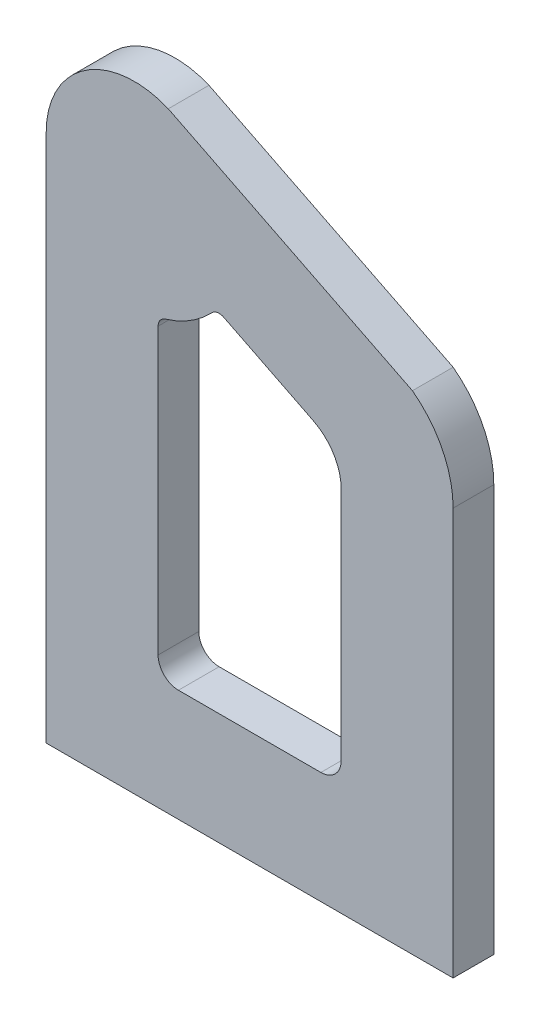
ISO-10303-21;
HEADER;
FILE_DESCRIPTION(('STEP AP214'),'2;1');
FILE_NAME('part.step','',(''),(''),'','','');
FILE_SCHEMA(('AUTOMOTIVE_DESIGN { 1 0 10303 214 1 1 1 1 }'));
ENDSEC;
DATA;
#1=APPLICATION_CONTEXT('core data for automotive mechanical design processes');
#2=APPLICATION_PROTOCOL_DEFINITION('international standard','automotive_design',2000,#1);
#3=PRODUCT_CONTEXT('',#1,'mechanical');
#4=PRODUCT('Part','Part','',(#3));
#5=PRODUCT_RELATED_PRODUCT_CATEGORY('part','',(#4));
#6=PRODUCT_DEFINITION_FORMATION('','',#4);
#7=PRODUCT_DEFINITION_CONTEXT('part definition',#1,'design');
#8=PRODUCT_DEFINITION('design','',#6,#7);
#9=PRODUCT_DEFINITION_SHAPE('','',#8);
#10=(LENGTH_UNIT() NAMED_UNIT(*) SI_UNIT(.MILLI.,.METRE.));
#11=(NAMED_UNIT(*) PLANE_ANGLE_UNIT() SI_UNIT($,.RADIAN.));
#12=(NAMED_UNIT(*) SI_UNIT($,.STERADIAN.) SOLID_ANGLE_UNIT());
#13=UNCERTAINTY_MEASURE_WITH_UNIT(LENGTH_MEASURE(1.E-05),#10,'distance_accuracy_value','');
#14=(GEOMETRIC_REPRESENTATION_CONTEXT(3) GLOBAL_UNCERTAINTY_ASSIGNED_CONTEXT((#13)) GLOBAL_UNIT_ASSIGNED_CONTEXT((#10,
#11,#12)) REPRESENTATION_CONTEXT('',''));
#15=CARTESIAN_POINT('',(0.,0.,0.));
#16=DIRECTION('',(0.,0.,1.));
#17=DIRECTION('',(1.,0.,0.));
#18=AXIS2_PLACEMENT_3D('',#15,#16,#17);
#19=CARTESIAN_POINT('',(-46.6666666666667,160.,20.));
#20=DIRECTION('',(0.,0.,-1.));
#21=DIRECTION('',(-1.,0.,0.));
#22=AXIS2_PLACEMENT_3D('',#19,#20,#21);
#23=PLANE('',#22);
#24=DIRECTION('',(0.,1.,0.));
#25=VECTOR('',#24,1.);
#26=CARTESIAN_POINT('',(-90.,-100.,20.));
#27=LINE('',#26,#25);
#28=CARTESIAN_POINT('',(-90.,-100.,20.));
#29=VERTEX_POINT('',#28);
#30=CARTESIAN_POINT('',(-90.,160.,20.));
#31=VERTEX_POINT('',#30);
#32=EDGE_CURVE('E239',#29,#31,#27,.T.);
#33=ORIENTED_EDGE('',*,*,#32,.F.);
#34=DIRECTION('',(1.,0.,0.));
#35=VECTOR('',#34,1.);
#36=CARTESIAN_POINT('',(-90.,-100.,20.));
#37=LINE('',#36,#35);
#38=CARTESIAN_POINT('',(110.,-100.,20.));
#39=VERTEX_POINT('',#38);
#40=EDGE_CURVE('E253',#29,#39,#37,.T.);
#41=ORIENTED_EDGE('',*,*,#40,.T.);
#42=DIRECTION('',(0.,1.,0.));
#43=VECTOR('',#42,1.);
#44=CARTESIAN_POINT('',(110.,-100.,20.));
#45=LINE('',#44,#43);
#46=CARTESIAN_POINT('',(110.,100.,20.));
#47=VERTEX_POINT('',#46);
#48=EDGE_CURVE('E251',#39,#47,#45,.T.);
#49=ORIENTED_EDGE('',*,*,#48,.T.);
#50=CARTESIAN_POINT('',(60.,100.,20.));
#51=DIRECTION('',(0.,0.,1.));
#52=DIRECTION('',(1.,0.,0.));
#53=AXIS2_PLACEMENT_3D('',#50,#51,#52);
#54=CIRCLE('',#53,50.);
#55=CARTESIAN_POINT('',(90.,140.,20.));
#56=VERTEX_POINT('',#55);
#57=EDGE_CURVE('E249',#47,#56,#54,.T.);
#58=ORIENTED_EDGE('',*,*,#57,.T.);
#59=DIRECTION('',(0.894427190999916,-0.447213595499958,0.));
#60=VECTOR('',#59,1.);
#61=CARTESIAN_POINT('',(-30.,200.,20.));
#62=LINE('',#61,#60);
#63=CARTESIAN_POINT('',(-30.,200.,20.));
#64=VERTEX_POINT('',#63);
#65=EDGE_CURVE('E246',#64,#56,#62,.T.);
#66=ORIENTED_EDGE('',*,*,#65,.F.);
#67=CARTESIAN_POINT('',(-46.6666666666667,160.,20.));
#68=DIRECTION('',(0.,0.,-1.));
#69=DIRECTION('',(-1.,0.,0.));
#70=AXIS2_PLACEMENT_3D('',#67,#68,#69);
#71=CIRCLE('',#70,43.3333333333333);
#72=EDGE_CURVE('E242',#31,#64,#71,.T.);
#73=ORIENTED_EDGE('',*,*,#72,.F.);
#74=EDGE_LOOP('',(#33,#41,#49,#58,#66,#73));
#75=FACE_BOUND('',#74,.T.);
#76=CARTESIAN_POINT('',(45.,-35.,20.));
#77=DIRECTION('',(0.,0.,1.));
#78=DIRECTION('',(1.,0.,0.));
#79=AXIS2_PLACEMENT_3D('',#76,#77,#78);
#80=CIRCLE('',#79,10.);
#81=CARTESIAN_POINT('',(45.,-45.,20.));
#82=VERTEX_POINT('',#81);
#83=CARTESIAN_POINT('',(55.,-34.9999999999999,20.));
#84=VERTEX_POINT('',#83);
#85=EDGE_CURVE('E156',#82,#84,#80,.T.);
#86=ORIENTED_EDGE('',*,*,#85,.F.);
#87=DIRECTION('',(-1.,0.,0.));
#88=VECTOR('',#87,1.);
#89=CARTESIAN_POINT('',(45.,-45.,20.));
#90=LINE('',#89,#88);
#91=CARTESIAN_POINT('',(-24.9999999999999,-45.,20.));
#92=VERTEX_POINT('',#91);
#93=EDGE_CURVE('E198',#82,#92,#90,.T.);
#94=ORIENTED_EDGE('',*,*,#93,.T.);
#95=CARTESIAN_POINT('',(-25.,-35.,20.));
#96=DIRECTION('',(0.,0.,1.));
#97=DIRECTION('',(1.,0.,0.));
#98=AXIS2_PLACEMENT_3D('',#95,#96,#97);
#99=CIRCLE('',#98,10.);
#100=CARTESIAN_POINT('',(-35.,-34.9999999999999,20.));
#101=VERTEX_POINT('',#100);
#102=EDGE_CURVE('E195',#101,#92,#99,.T.);
#103=ORIENTED_EDGE('',*,*,#102,.F.);
#104=DIRECTION('',(0.,1.,0.));
#105=VECTOR('',#104,1.);
#106=CARTESIAN_POINT('',(-35.,-34.9999999999999,20.));
#107=LINE('',#106,#105);
#108=CARTESIAN_POINT('',(-35.,104.968443396336,20.));
#109=VERTEX_POINT('',#108);
#110=EDGE_CURVE('E192',#101,#109,#107,.T.);
#111=ORIENTED_EDGE('',*,*,#110,.T.);
#112=CARTESIAN_POINT('',(-30.,104.968443396336,20.));
#113=DIRECTION('',(0.,0.,-1.));
#114=DIRECTION('',(-1.,0.,0.));
#115=AXIS2_PLACEMENT_3D('',#112,#113,#114);
#116=CIRCLE('',#115,5.);
#117=CARTESIAN_POINT('',(-31.4492753623188,109.753796144481,20.));
#118=VERTEX_POINT('',#117);
#119=EDGE_CURVE('E189',#109,#118,#116,.T.);
#120=ORIENTED_EDGE('',*,*,#119,.T.);
#121=CARTESIAN_POINT('',(-46.6666666666667,160.,20.));
#122=DIRECTION('',(0.,0.,-1.));
#123=DIRECTION('',(-1.,0.,0.));
#124=AXIS2_PLACEMENT_3D('',#121,#122,#123);
#125=CIRCLE('',#124,52.5);
#126=CARTESIAN_POINT('',(-8.59793172106234,123.847248795682,20.));
#127=VERTEX_POINT('',#126);
#128=EDGE_CURVE('E187',#127,#118,#125,.T.);
#129=ORIENTED_EDGE('',*,*,#128,.F.);
#130=CARTESIAN_POINT('',(-4.97233791671911,120.404129633366,20.));
#131=DIRECTION('',(0.,0.,1.));
#132=DIRECTION('',(1.,0.,0.));
#133=AXIS2_PLACEMENT_3D('',#130,#131,#132);
#134=CIRCLE('',#133,4.99999999999999);
#135=CARTESIAN_POINT('',(-2.73626993921932,124.876265588365,20.));
#136=VERTEX_POINT('',#135);
#137=EDGE_CURVE('E185',#136,#127,#134,.T.);
#138=ORIENTED_EDGE('',*,*,#137,.F.);
#139=DIRECTION('',(0.894427190999916,-0.447213595499958,0.));
#140=VECTOR('',#139,1.);
#141=CARTESIAN_POINT('',(-2.73626993921932,124.876265588365,20.));
#142=LINE('',#141,#140);
#143=CARTESIAN_POINT('',(41.1803398874989,102.917960675006,20.));
#144=VERTEX_POINT('',#143);
#145=EDGE_CURVE('E181',#136,#144,#142,.T.);
#146=ORIENTED_EDGE('',*,*,#145,.T.);
#147=CARTESIAN_POINT('',(30.,80.5572809000084,20.));
#148=DIRECTION('',(0.,0.,-1.));
#149=DIRECTION('',(-1.,0.,0.));
#150=AXIS2_PLACEMENT_3D('',#147,#148,#149);
#151=CIRCLE('',#150,25.);
#152=CARTESIAN_POINT('',(55.,80.5572809000083,20.));
#153=VERTEX_POINT('',#152);
#154=EDGE_CURVE('E179',#144,#153,#151,.T.);
#155=ORIENTED_EDGE('',*,*,#154,.T.);
#156=DIRECTION('',(0.,-1.,0.));
#157=VECTOR('',#156,1.);
#158=CARTESIAN_POINT('',(55.,80.5572809000083,20.));
#159=LINE('',#158,#157);
#160=EDGE_CURVE('E165',#153,#84,#159,.T.);
#161=ORIENTED_EDGE('',*,*,#160,.T.);
#162=EDGE_LOOP('',(#86,#94,#103,#111,#120,#129,#138,#146,#155,#161));
#163=FACE_BOUND('',#162,.T.);
#164=ADVANCED_FACE('F43',(#75,#163),#23,.F.);
#165=CARTESIAN_POINT('',(-46.6666666666667,160.,0.));
#166=DIRECTION('',(0.,0.,-1.));
#167=DIRECTION('',(-1.,0.,0.));
#168=AXIS2_PLACEMENT_3D('',#165,#166,#167);
#169=PLANE('',#168);
#170=DIRECTION('',(0.,1.,0.));
#171=VECTOR('',#170,1.);
#172=CARTESIAN_POINT('',(-90.,-100.,0.));
#173=LINE('',#172,#171);
#174=CARTESIAN_POINT('',(-90.,-100.,0.));
#175=VERTEX_POINT('',#174);
#176=CARTESIAN_POINT('',(-90.,160.,0.));
#177=VERTEX_POINT('',#176);
#178=EDGE_CURVE('E174',#175,#177,#173,.T.);
#179=ORIENTED_EDGE('',*,*,#178,.T.);
#180=CARTESIAN_POINT('',(-46.6666666666667,160.,0.));
#181=DIRECTION('',(0.,0.,-1.));
#182=DIRECTION('',(-1.,0.,0.));
#183=AXIS2_PLACEMENT_3D('',#180,#181,#182);
#184=CIRCLE('',#183,43.3333333333333);
#185=CARTESIAN_POINT('',(-30.,200.,0.));
#186=VERTEX_POINT('',#185);
#187=EDGE_CURVE('E257',#177,#186,#184,.T.);
#188=ORIENTED_EDGE('',*,*,#187,.T.);
#189=DIRECTION('',(0.894427190999916,-0.447213595499958,0.));
#190=VECTOR('',#189,1.);
#191=CARTESIAN_POINT('',(-30.,200.,0.));
#192=LINE('',#191,#190);
#193=CARTESIAN_POINT('',(90.,140.,0.));
#194=VERTEX_POINT('',#193);
#195=EDGE_CURVE('E260',#186,#194,#192,.T.);
#196=ORIENTED_EDGE('',*,*,#195,.T.);
#197=CARTESIAN_POINT('',(60.,100.,0.));
#198=DIRECTION('',(0.,0.,1.));
#199=DIRECTION('',(1.,0.,0.));
#200=AXIS2_PLACEMENT_3D('',#197,#198,#199);
#201=CIRCLE('',#200,50.);
#202=CARTESIAN_POINT('',(110.,100.,0.));
#203=VERTEX_POINT('',#202);
#204=EDGE_CURVE('E263',#203,#194,#201,.T.);
#205=ORIENTED_EDGE('',*,*,#204,.F.);
#206=DIRECTION('',(0.,1.,0.));
#207=VECTOR('',#206,1.);
#208=CARTESIAN_POINT('',(110.,-100.,0.));
#209=LINE('',#208,#207);
#210=CARTESIAN_POINT('',(110.,-100.,0.));
#211=VERTEX_POINT('',#210);
#212=EDGE_CURVE('E266',#211,#203,#209,.T.);
#213=ORIENTED_EDGE('',*,*,#212,.F.);
#214=DIRECTION('',(1.,0.,0.));
#215=VECTOR('',#214,1.);
#216=CARTESIAN_POINT('',(-90.,-100.,0.));
#217=LINE('',#216,#215);
#218=EDGE_CURVE('E243',#175,#211,#217,.T.);
#219=ORIENTED_EDGE('',*,*,#218,.F.);
#220=EDGE_LOOP('',(#179,#188,#196,#205,#213,#219));
#221=FACE_BOUND('',#220,.T.);
#222=DIRECTION('',(-1.,0.,0.));
#223=VECTOR('',#222,1.);
#224=CARTESIAN_POINT('',(45.,-45.,0.));
#225=LINE('',#224,#223);
#226=CARTESIAN_POINT('',(45.,-45.,0.));
#227=VERTEX_POINT('',#226);
#228=CARTESIAN_POINT('',(-24.9999999999999,-45.,0.));
#229=VERTEX_POINT('',#228);
#230=EDGE_CURVE('E166',#227,#229,#225,.T.);
#231=ORIENTED_EDGE('',*,*,#230,.F.);
#232=CARTESIAN_POINT('',(45.,-35.,0.));
#233=DIRECTION('',(0.,0.,1.));
#234=DIRECTION('',(1.,0.,0.));
#235=AXIS2_PLACEMENT_3D('',#232,#233,#234);
#236=CIRCLE('',#235,10.);
#237=CARTESIAN_POINT('',(55.,-34.9999999999999,0.));
#238=VERTEX_POINT('',#237);
#239=EDGE_CURVE('E68',#227,#238,#236,.T.);
#240=ORIENTED_EDGE('',*,*,#239,.T.);
#241=DIRECTION('',(0.,-1.,0.));
#242=VECTOR('',#241,1.);
#243=CARTESIAN_POINT('',(55.,80.5572809000083,0.));
#244=LINE('',#243,#242);
#245=CARTESIAN_POINT('',(55.,80.5572809000083,0.));
#246=VERTEX_POINT('',#245);
#247=EDGE_CURVE('E173',#246,#238,#244,.T.);
#248=ORIENTED_EDGE('',*,*,#247,.F.);
#249=CARTESIAN_POINT('',(30.,80.5572809000084,0.));
#250=DIRECTION('',(0.,0.,-1.));
#251=DIRECTION('',(-1.,0.,0.));
#252=AXIS2_PLACEMENT_3D('',#249,#250,#251);
#253=CIRCLE('',#252,25.);
#254=CARTESIAN_POINT('',(41.1803398874989,102.917960675006,0.));
#255=VERTEX_POINT('',#254);
#256=EDGE_CURVE('E202',#255,#246,#253,.T.);
#257=ORIENTED_EDGE('',*,*,#256,.F.);
#258=DIRECTION('',(0.894427190999916,-0.447213595499958,0.));
#259=VECTOR('',#258,1.);
#260=CARTESIAN_POINT('',(-2.73626993921932,124.876265588365,0.));
#261=LINE('',#260,#259);
#262=CARTESIAN_POINT('',(-2.73626993921932,124.876265588365,0.));
#263=VERTEX_POINT('',#262);
#264=EDGE_CURVE('E205',#263,#255,#261,.T.);
#265=ORIENTED_EDGE('',*,*,#264,.F.);
#266=CARTESIAN_POINT('',(-4.97233791671911,120.404129633366,0.));
#267=DIRECTION('',(0.,0.,1.));
#268=DIRECTION('',(1.,0.,0.));
#269=AXIS2_PLACEMENT_3D('',#266,#267,#268);
#270=CIRCLE('',#269,4.99999999999999);
#271=CARTESIAN_POINT('',(-8.59793172106234,123.847248795682,0.));
#272=VERTEX_POINT('',#271);
#273=EDGE_CURVE('E208',#263,#272,#270,.T.);
#274=ORIENTED_EDGE('',*,*,#273,.T.);
#275=CARTESIAN_POINT('',(-46.6666666666667,160.,0.));
#276=DIRECTION('',(0.,0.,-1.));
#277=DIRECTION('',(-1.,0.,0.));
#278=AXIS2_PLACEMENT_3D('',#275,#276,#277);
#279=CIRCLE('',#278,52.5);
#280=CARTESIAN_POINT('',(-31.4492753623188,109.753796144481,0.));
#281=VERTEX_POINT('',#280);
#282=EDGE_CURVE('E211',#272,#281,#279,.T.);
#283=ORIENTED_EDGE('',*,*,#282,.T.);
#284=CARTESIAN_POINT('',(-30.,104.968443396336,0.));
#285=DIRECTION('',(0.,0.,-1.));
#286=DIRECTION('',(-1.,0.,0.));
#287=AXIS2_PLACEMENT_3D('',#284,#285,#286);
#288=CIRCLE('',#287,5.);
#289=CARTESIAN_POINT('',(-35.,104.968443396336,0.));
#290=VERTEX_POINT('',#289);
#291=EDGE_CURVE('E214',#290,#281,#288,.T.);
#292=ORIENTED_EDGE('',*,*,#291,.F.);
#293=DIRECTION('',(0.,1.,0.));
#294=VECTOR('',#293,1.);
#295=CARTESIAN_POINT('',(-35.,-34.9999999999999,0.));
#296=LINE('',#295,#294);
#297=CARTESIAN_POINT('',(-35.,-34.9999999999999,0.));
#298=VERTEX_POINT('',#297);
#299=EDGE_CURVE('E217',#298,#290,#296,.T.);
#300=ORIENTED_EDGE('',*,*,#299,.F.);
#301=CARTESIAN_POINT('',(-25.,-35.,0.));
#302=DIRECTION('',(0.,0.,1.));
#303=DIRECTION('',(1.,0.,0.));
#304=AXIS2_PLACEMENT_3D('',#301,#302,#303);
#305=CIRCLE('',#304,10.);
#306=EDGE_CURVE('E220',#298,#229,#305,.T.);
#307=ORIENTED_EDGE('',*,*,#306,.T.);
#308=EDGE_LOOP('',(#231,#240,#248,#257,#265,#274,#283,#292,#300,#307));
#309=FACE_BOUND('',#308,.T.);
#310=ADVANCED_FACE('F286',(#221,#309),#169,.T.);
#311=CARTESIAN_POINT('',(-90.,-100.,20.));
#312=DIRECTION('',(-1.,0.,0.));
#313=DIRECTION('',(0.,0.,1.));
#314=AXIS2_PLACEMENT_3D('',#311,#312,#313);
#315=PLANE('',#314);
#316=ORIENTED_EDGE('',*,*,#178,.F.);
#317=DIRECTION('',(0.,0.,-1.));
#318=VECTOR('',#317,1.);
#319=CARTESIAN_POINT('',(-90.,-100.,20.));
#320=LINE('',#319,#318);
#321=EDGE_CURVE('E11',#29,#175,#320,.T.);
#322=ORIENTED_EDGE('',*,*,#321,.F.);
#323=ORIENTED_EDGE('',*,*,#32,.T.);
#324=DIRECTION('',(0.,0.,-1.));
#325=VECTOR('',#324,1.);
#326=CARTESIAN_POINT('',(-90.,160.,20.));
#327=LINE('',#326,#325);
#328=EDGE_CURVE('E47',#31,#177,#327,.T.);
#329=ORIENTED_EDGE('',*,*,#328,.T.);
#330=EDGE_LOOP('',(#316,#322,#323,#329));
#331=FACE_BOUND('',#330,.T.);
#332=ADVANCED_FACE('F45',(#331),#315,.T.);
#333=CARTESIAN_POINT('',(-90.,-100.,20.));
#334=DIRECTION('',(0.,1.,0.));
#335=DIRECTION('',(0.,0.,1.));
#336=AXIS2_PLACEMENT_3D('',#333,#334,#335);
#337=PLANE('',#336);
#338=ORIENTED_EDGE('',*,*,#218,.T.);
#339=DIRECTION('',(0.,0.,-1.));
#340=VECTOR('',#339,1.);
#341=CARTESIAN_POINT('',(110.,-100.,20.));
#342=LINE('',#341,#340);
#343=EDGE_CURVE('E52',#39,#211,#342,.T.);
#344=ORIENTED_EDGE('',*,*,#343,.F.);
#345=ORIENTED_EDGE('',*,*,#40,.F.);
#346=ORIENTED_EDGE('',*,*,#321,.T.);
#347=EDGE_LOOP('',(#338,#344,#345,#346));
#348=FACE_BOUND('',#347,.T.);
#349=ADVANCED_FACE('F292',(#348),#337,.F.);
#350=CARTESIAN_POINT('',(110.,-100.,20.));
#351=DIRECTION('',(-1.,0.,0.));
#352=DIRECTION('',(0.,0.,1.));
#353=AXIS2_PLACEMENT_3D('',#350,#351,#352);
#354=PLANE('',#353);
#355=ORIENTED_EDGE('',*,*,#212,.T.);
#356=DIRECTION('',(0.,0.,-1.));
#357=VECTOR('',#356,1.);
#358=CARTESIAN_POINT('',(110.,100.,20.));
#359=LINE('',#358,#357);
#360=EDGE_CURVE('E271',#47,#203,#359,.T.);
#361=ORIENTED_EDGE('',*,*,#360,.F.);
#362=ORIENTED_EDGE('',*,*,#48,.F.);
#363=ORIENTED_EDGE('',*,*,#343,.T.);
#364=EDGE_LOOP('',(#355,#361,#362,#363));
#365=FACE_BOUND('',#364,.T.);
#366=ADVANCED_FACE('F296',(#365),#354,.F.);
#367=CARTESIAN_POINT('',(60.,100.,20.));
#368=DIRECTION('',(0.,0.,-1.));
#369=DIRECTION('',(-1.,0.,0.));
#370=AXIS2_PLACEMENT_3D('',#367,#368,#369);
#371=CYLINDRICAL_SURFACE('',#370,50.);
#372=ORIENTED_EDGE('',*,*,#204,.T.);
#373=DIRECTION('',(0.,0.,-1.));
#374=VECTOR('',#373,1.);
#375=CARTESIAN_POINT('',(90.,140.,20.));
#376=LINE('',#375,#374);
#377=EDGE_CURVE('E274',#56,#194,#376,.T.);
#378=ORIENTED_EDGE('',*,*,#377,.F.);
#379=ORIENTED_EDGE('',*,*,#57,.F.);
#380=ORIENTED_EDGE('',*,*,#360,.T.);
#381=EDGE_LOOP('',(#372,#378,#379,#380));
#382=FACE_BOUND('',#381,.T.);
#383=ADVANCED_FACE('F305',(#382),#371,.T.);
#384=CARTESIAN_POINT('',(-30.,200.,20.));
#385=DIRECTION('',(0.447213595499958,0.894427190999916,0.));
#386=DIRECTION('',(-0.894427190999916,0.447213595499958,0.));
#387=AXIS2_PLACEMENT_3D('',#384,#385,#386);
#388=PLANE('',#387);
#389=ORIENTED_EDGE('',*,*,#195,.F.);
#390=DIRECTION('',(0.,0.,-1.));
#391=VECTOR('',#390,1.);
#392=CARTESIAN_POINT('',(-30.,200.,20.));
#393=LINE('',#392,#391);
#394=EDGE_CURVE('E275',#64,#186,#393,.T.);
#395=ORIENTED_EDGE('',*,*,#394,.F.);
#396=ORIENTED_EDGE('',*,*,#65,.T.);
#397=ORIENTED_EDGE('',*,*,#377,.T.);
#398=EDGE_LOOP('',(#389,#395,#396,#397));
#399=FACE_BOUND('',#398,.T.);
#400=ADVANCED_FACE('F303',(#399),#388,.T.);
#401=CARTESIAN_POINT('',(-46.6666666666667,160.,20.));
#402=DIRECTION('',(0.,0.,-1.));
#403=DIRECTION('',(-1.,0.,0.));
#404=AXIS2_PLACEMENT_3D('',#401,#402,#403);
#405=CYLINDRICAL_SURFACE('',#404,43.3333333333333);
#406=ORIENTED_EDGE('',*,*,#187,.F.);
#407=ORIENTED_EDGE('',*,*,#328,.F.);
#408=ORIENTED_EDGE('',*,*,#72,.T.);
#409=ORIENTED_EDGE('',*,*,#394,.T.);
#410=EDGE_LOOP('',(#406,#407,#408,#409));
#411=FACE_BOUND('',#410,.T.);
#412=ADVANCED_FACE('F283',(#411),#405,.T.);
#413=CARTESIAN_POINT('',(45.,-35.,20.));
#414=DIRECTION('',(0.,0.,-1.));
#415=DIRECTION('',(-1.,0.,0.));
#416=AXIS2_PLACEMENT_3D('',#413,#414,#415);
#417=CYLINDRICAL_SURFACE('',#416,10.);
#418=ORIENTED_EDGE('',*,*,#239,.F.);
#419=DIRECTION('',(0.,0.,-1.));
#420=VECTOR('',#419,1.);
#421=CARTESIAN_POINT('',(45.,-45.,20.));
#422=LINE('',#421,#420);
#423=EDGE_CURVE('E161',#82,#227,#422,.T.);
#424=ORIENTED_EDGE('',*,*,#423,.F.);
#425=ORIENTED_EDGE('',*,*,#85,.T.);
#426=DIRECTION('',(0.,0.,-1.));
#427=VECTOR('',#426,1.);
#428=CARTESIAN_POINT('',(55.,-34.9999999999999,20.));
#429=LINE('',#428,#427);
#430=EDGE_CURVE('E159',#84,#238,#429,.T.);
#431=ORIENTED_EDGE('',*,*,#430,.T.);
#432=EDGE_LOOP('',(#418,#424,#425,#431));
#433=FACE_BOUND('',#432,.T.);
#434=ADVANCED_FACE('F158',(#433),#417,.F.);
#435=CARTESIAN_POINT('',(55.,80.5572809000083,20.));
#436=DIRECTION('',(1.,0.,0.));
#437=DIRECTION('',(0.,1.,0.));
#438=AXIS2_PLACEMENT_3D('',#435,#436,#437);
#439=PLANE('',#438);
#440=ORIENTED_EDGE('',*,*,#247,.T.);
#441=ORIENTED_EDGE('',*,*,#430,.F.);
#442=ORIENTED_EDGE('',*,*,#160,.F.);
#443=DIRECTION('',(0.,0.,-1.));
#444=VECTOR('',#443,1.);
#445=CARTESIAN_POINT('',(55.,80.5572809000083,20.));
#446=LINE('',#445,#444);
#447=EDGE_CURVE('E175',#153,#246,#446,.T.);
#448=ORIENTED_EDGE('',*,*,#447,.T.);
#449=EDGE_LOOP('',(#440,#441,#442,#448));
#450=FACE_BOUND('',#449,.T.);
#451=ADVANCED_FACE('F170',(#450),#439,.F.);
#452=CARTESIAN_POINT('',(30.,80.5572809000084,20.));
#453=DIRECTION('',(0.,0.,-1.));
#454=DIRECTION('',(-1.,0.,0.));
#455=AXIS2_PLACEMENT_3D('',#452,#453,#454);
#456=CYLINDRICAL_SURFACE('',#455,25.);
#457=ORIENTED_EDGE('',*,*,#256,.T.);
#458=ORIENTED_EDGE('',*,*,#447,.F.);
#459=ORIENTED_EDGE('',*,*,#154,.F.);
#460=DIRECTION('',(0.,0.,-1.));
#461=VECTOR('',#460,1.);
#462=CARTESIAN_POINT('',(41.1803398874989,102.917960675006,20.));
#463=LINE('',#462,#461);
#464=EDGE_CURVE('E236',#144,#255,#463,.T.);
#465=ORIENTED_EDGE('',*,*,#464,.T.);
#466=EDGE_LOOP('',(#457,#458,#459,#465));
#467=FACE_BOUND('',#466,.T.);
#468=ADVANCED_FACE('F364',(#467),#456,.F.);
#469=CARTESIAN_POINT('',(-2.73626993921932,124.876265588365,20.));
#470=DIRECTION('',(0.447213595499958,0.894427190999916,0.));
#471=DIRECTION('',(-0.894427190999916,0.447213595499958,0.));
#472=AXIS2_PLACEMENT_3D('',#469,#470,#471);
#473=PLANE('',#472);
#474=ORIENTED_EDGE('',*,*,#264,.T.);
#475=ORIENTED_EDGE('',*,*,#464,.F.);
#476=ORIENTED_EDGE('',*,*,#145,.F.);
#477=DIRECTION('',(0.,0.,-1.));
#478=VECTOR('',#477,1.);
#479=CARTESIAN_POINT('',(-2.73626993921932,124.876265588365,20.));
#480=LINE('',#479,#478);
#481=EDGE_CURVE('E234',#136,#263,#480,.T.);
#482=ORIENTED_EDGE('',*,*,#481,.T.);
#483=EDGE_LOOP('',(#474,#475,#476,#482));
#484=FACE_BOUND('',#483,.T.);
#485=ADVANCED_FACE('F370',(#484),#473,.F.);
#486=CARTESIAN_POINT('',(-4.97233791671911,120.404129633366,20.));
#487=DIRECTION('',(0.,0.,-1.));
#488=DIRECTION('',(-1.,0.,0.));
#489=AXIS2_PLACEMENT_3D('',#486,#487,#488);
#490=CYLINDRICAL_SURFACE('',#489,4.99999999999999);
#491=ORIENTED_EDGE('',*,*,#273,.F.);
#492=ORIENTED_EDGE('',*,*,#481,.F.);
#493=ORIENTED_EDGE('',*,*,#137,.T.);
#494=DIRECTION('',(0.,0.,-1.));
#495=VECTOR('',#494,1.);
#496=CARTESIAN_POINT('',(-8.59793172106234,123.847248795682,20.));
#497=LINE('',#496,#495);
#498=EDGE_CURVE('E232',#127,#272,#497,.T.);
#499=ORIENTED_EDGE('',*,*,#498,.T.);
#500=EDGE_LOOP('',(#491,#492,#493,#499));
#501=FACE_BOUND('',#500,.T.);
#502=ADVANCED_FACE('F378',(#501),#490,.F.);
#503=CARTESIAN_POINT('',(-46.6666666666667,160.,20.));
#504=DIRECTION('',(0.,0.,-1.));
#505=DIRECTION('',(-1.,0.,0.));
#506=AXIS2_PLACEMENT_3D('',#503,#504,#505);
#507=CYLINDRICAL_SURFACE('',#506,52.5);
#508=ORIENTED_EDGE('',*,*,#282,.F.);
#509=ORIENTED_EDGE('',*,*,#498,.F.);
#510=ORIENTED_EDGE('',*,*,#128,.T.);
#511=DIRECTION('',(0.,0.,-1.));
#512=VECTOR('',#511,1.);
#513=CARTESIAN_POINT('',(-31.4492753623188,109.753796144481,20.));
#514=LINE('',#513,#512);
#515=EDGE_CURVE('E230',#118,#281,#514,.T.);
#516=ORIENTED_EDGE('',*,*,#515,.T.);
#517=EDGE_LOOP('',(#508,#509,#510,#516));
#518=FACE_BOUND('',#517,.T.);
#519=ADVANCED_FACE('F386',(#518),#507,.T.);
#520=CARTESIAN_POINT('',(-30.,104.968443396336,20.));
#521=DIRECTION('',(0.,0.,-1.));
#522=DIRECTION('',(-1.,0.,0.));
#523=AXIS2_PLACEMENT_3D('',#520,#521,#522);
#524=CYLINDRICAL_SURFACE('',#523,5.);
#525=ORIENTED_EDGE('',*,*,#291,.T.);
#526=ORIENTED_EDGE('',*,*,#515,.F.);
#527=ORIENTED_EDGE('',*,*,#119,.F.);
#528=DIRECTION('',(0.,0.,-1.));
#529=VECTOR('',#528,1.);
#530=CARTESIAN_POINT('',(-35.,104.968443396336,20.));
#531=LINE('',#530,#529);
#532=EDGE_CURVE('E228',#109,#290,#531,.T.);
#533=ORIENTED_EDGE('',*,*,#532,.T.);
#534=EDGE_LOOP('',(#525,#526,#527,#533));
#535=FACE_BOUND('',#534,.T.);
#536=ADVANCED_FACE('F394',(#535),#524,.F.);
#537=CARTESIAN_POINT('',(-35.,-34.9999999999999,20.));
#538=DIRECTION('',(-1.,0.,0.));
#539=DIRECTION('',(0.,-1.,0.));
#540=AXIS2_PLACEMENT_3D('',#537,#538,#539);
#541=PLANE('',#540);
#542=ORIENTED_EDGE('',*,*,#299,.T.);
#543=ORIENTED_EDGE('',*,*,#532,.F.);
#544=ORIENTED_EDGE('',*,*,#110,.F.);
#545=DIRECTION('',(0.,0.,-1.));
#546=VECTOR('',#545,1.);
#547=CARTESIAN_POINT('',(-35.,-34.9999999999999,20.));
#548=LINE('',#547,#546);
#549=EDGE_CURVE('E226',#101,#298,#548,.T.);
#550=ORIENTED_EDGE('',*,*,#549,.T.);
#551=EDGE_LOOP('',(#542,#543,#544,#550));
#552=FACE_BOUND('',#551,.T.);
#553=ADVANCED_FACE('F402',(#552),#541,.F.);
#554=CARTESIAN_POINT('',(-25.,-35.,20.));
#555=DIRECTION('',(0.,0.,-1.));
#556=DIRECTION('',(-1.,0.,0.));
#557=AXIS2_PLACEMENT_3D('',#554,#555,#556);
#558=CYLINDRICAL_SURFACE('',#557,10.);
#559=ORIENTED_EDGE('',*,*,#306,.F.);
#560=ORIENTED_EDGE('',*,*,#549,.F.);
#561=ORIENTED_EDGE('',*,*,#102,.T.);
#562=DIRECTION('',(0.,0.,-1.));
#563=VECTOR('',#562,1.);
#564=CARTESIAN_POINT('',(-24.9999999999999,-45.,20.));
#565=LINE('',#564,#563);
#566=EDGE_CURVE('E60',#92,#229,#565,.T.);
#567=ORIENTED_EDGE('',*,*,#566,.T.);
#568=EDGE_LOOP('',(#559,#560,#561,#567));
#569=FACE_BOUND('',#568,.T.);
#570=ADVANCED_FACE('F410',(#569),#558,.F.);
#571=CARTESIAN_POINT('',(45.,-45.,20.));
#572=DIRECTION('',(0.,-1.,0.));
#573=DIRECTION('',(0.,0.,-1.));
#574=AXIS2_PLACEMENT_3D('',#571,#572,#573);
#575=PLANE('',#574);
#576=ORIENTED_EDGE('',*,*,#230,.T.);
#577=ORIENTED_EDGE('',*,*,#566,.F.);
#578=ORIENTED_EDGE('',*,*,#93,.F.);
#579=ORIENTED_EDGE('',*,*,#423,.T.);
#580=EDGE_LOOP('',(#576,#577,#578,#579));
#581=FACE_BOUND('',#580,.T.);
#582=ADVANCED_FACE('F418',(#581),#575,.F.);
#583=CLOSED_SHELL('',(#164,#310,#332,#349,#366,#383,#400,#412,#434,#451,#468,#485,#502,#519,
#536,#553,#570,#582));
#584=MANIFOLD_SOLID_BREP('B2',#583);
#585=ADVANCED_BREP_SHAPE_REPRESENTATION('',(#18,#584),#14);
#586=SHAPE_DEFINITION_REPRESENTATION(#9,#585);
ENDSEC;
END-ISO-10303-21;
